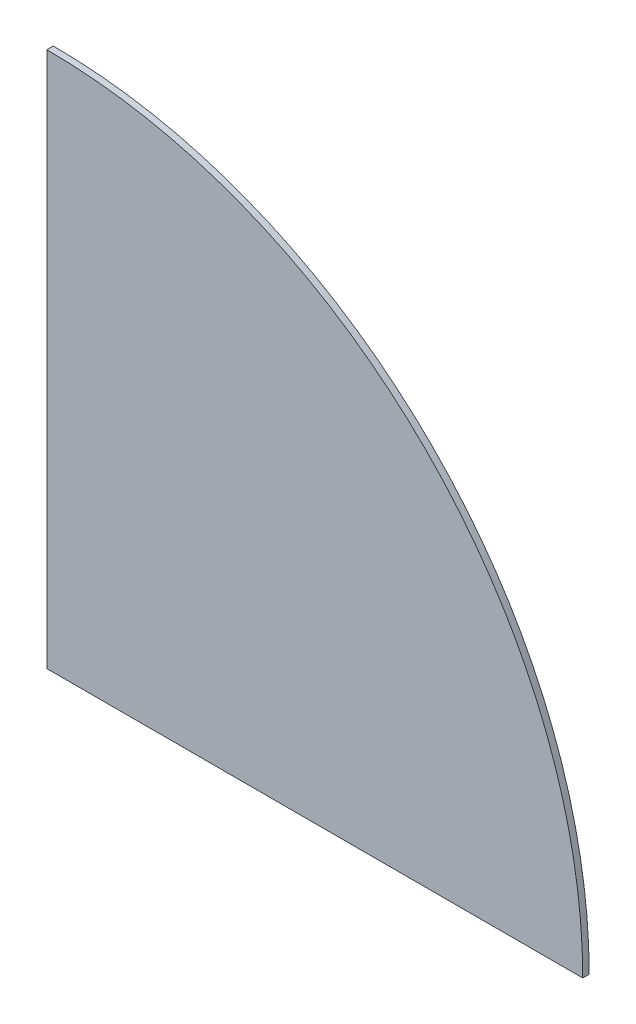
ISO-10303-21;
HEADER;
FILE_DESCRIPTION(('STEP AP214'),'2;1');
FILE_NAME('part.step','',(''),(''),'','','');
FILE_SCHEMA(('AUTOMOTIVE_DESIGN { 1 0 10303 214 1 1 1 1 }'));
ENDSEC;
DATA;
#1=APPLICATION_CONTEXT('core data for automotive mechanical design processes');
#2=APPLICATION_PROTOCOL_DEFINITION('international standard','automotive_design',2000,#1);
#3=PRODUCT_CONTEXT('',#1,'mechanical');
#4=PRODUCT('Part','Part','',(#3));
#5=PRODUCT_RELATED_PRODUCT_CATEGORY('part','',(#4));
#6=PRODUCT_DEFINITION_FORMATION('','',#4);
#7=PRODUCT_DEFINITION_CONTEXT('part definition',#1,'design');
#8=PRODUCT_DEFINITION('design','',#6,#7);
#9=PRODUCT_DEFINITION_SHAPE('','',#8);
#10=(LENGTH_UNIT() NAMED_UNIT(*) SI_UNIT(.MILLI.,.METRE.));
#11=(NAMED_UNIT(*) PLANE_ANGLE_UNIT() SI_UNIT($,.RADIAN.));
#12=(NAMED_UNIT(*) SI_UNIT($,.STERADIAN.) SOLID_ANGLE_UNIT());
#13=UNCERTAINTY_MEASURE_WITH_UNIT(LENGTH_MEASURE(1.E-05),#10,'distance_accuracy_value','');
#14=(GEOMETRIC_REPRESENTATION_CONTEXT(3) GLOBAL_UNCERTAINTY_ASSIGNED_CONTEXT((#13)) GLOBAL_UNIT_ASSIGNED_CONTEXT((#10,
#11,#12)) REPRESENTATION_CONTEXT('',''));
#15=CARTESIAN_POINT('',(0.,0.,0.));
#16=DIRECTION('',(0.,0.,1.));
#17=DIRECTION('',(1.,0.,0.));
#18=AXIS2_PLACEMENT_3D('',#15,#16,#17);
#19=CARTESIAN_POINT('',(0.,0.,1.6));
#20=DIRECTION('',(0.,1.,0.));
#21=DIRECTION('',(0.,0.,1.));
#22=AXIS2_PLACEMENT_3D('',#19,#20,#21);
#23=PLANE('',#22);
#24=DIRECTION('',(1.,0.,0.));
#25=VECTOR('',#24,1.);
#26=CARTESIAN_POINT('',(0.,0.,0.));
#27=LINE('',#26,#25);
#28=CARTESIAN_POINT('',(0.,0.,0.));
#29=VERTEX_POINT('',#28);
#30=CARTESIAN_POINT('',(133.,0.,0.));
#31=VERTEX_POINT('',#30);
#32=EDGE_CURVE('E83',#29,#31,#27,.T.);
#33=ORIENTED_EDGE('',*,*,#32,.T.);
#34=DIRECTION('',(0.,0.,-1.));
#35=VECTOR('',#34,1.);
#36=CARTESIAN_POINT('',(133.,0.,1.6));
#37=LINE('',#36,#35);
#38=CARTESIAN_POINT('',(133.,0.,1.6));
#39=VERTEX_POINT('',#38);
#40=EDGE_CURVE('E11',#39,#31,#37,.T.);
#41=ORIENTED_EDGE('',*,*,#40,.F.);
#42=DIRECTION('',(1.,0.,0.));
#43=VECTOR('',#42,1.);
#44=CARTESIAN_POINT('',(0.,0.,1.6));
#45=LINE('',#44,#43);
#46=CARTESIAN_POINT('',(0.,0.,1.6));
#47=VERTEX_POINT('',#46);
#48=EDGE_CURVE('E76',#47,#39,#45,.T.);
#49=ORIENTED_EDGE('',*,*,#48,.F.);
#50=DIRECTION('',(0.,0.,-1.));
#51=VECTOR('',#50,1.);
#52=CARTESIAN_POINT('',(0.,0.,1.6));
#53=LINE('',#52,#51);
#54=EDGE_CURVE('E84',#47,#29,#53,.T.);
#55=ORIENTED_EDGE('',*,*,#54,.T.);
#56=EDGE_LOOP('',(#33,#41,#49,#55));
#57=FACE_BOUND('',#56,.T.);
#58=ADVANCED_FACE('F36',(#57),#23,.F.);
#59=CARTESIAN_POINT('',(0.,0.,1.6));
#60=DIRECTION('',(0.,0.,-1.));
#61=DIRECTION('',(-1.,0.,0.));
#62=AXIS2_PLACEMENT_3D('',#59,#60,#61);
#63=CYLINDRICAL_SURFACE('',#62,133.);
#64=CARTESIAN_POINT('',(0.,0.,0.));
#65=DIRECTION('',(0.,0.,1.));
#66=DIRECTION('',(1.,0.,0.));
#67=AXIS2_PLACEMENT_3D('',#64,#65,#66);
#68=CIRCLE('',#67,133.);
#69=CARTESIAN_POINT('',(0.,133.,0.));
#70=VERTEX_POINT('',#69);
#71=EDGE_CURVE('E64',#31,#70,#68,.T.);
#72=ORIENTED_EDGE('',*,*,#71,.T.);
#73=DIRECTION('',(0.,0.,-1.));
#74=VECTOR('',#73,1.);
#75=CARTESIAN_POINT('',(0.,133.,1.6));
#76=LINE('',#75,#74);
#77=CARTESIAN_POINT('',(0.,133.,1.6));
#78=VERTEX_POINT('',#77);
#79=EDGE_CURVE('E44',#78,#70,#76,.T.);
#80=ORIENTED_EDGE('',*,*,#79,.F.);
#81=CARTESIAN_POINT('',(0.,0.,1.6));
#82=DIRECTION('',(0.,0.,1.));
#83=DIRECTION('',(1.,0.,0.));
#84=AXIS2_PLACEMENT_3D('',#81,#82,#83);
#85=CIRCLE('',#84,133.);
#86=EDGE_CURVE('E72',#39,#78,#85,.T.);
#87=ORIENTED_EDGE('',*,*,#86,.F.);
#88=ORIENTED_EDGE('',*,*,#40,.T.);
#89=EDGE_LOOP('',(#72,#80,#87,#88));
#90=FACE_BOUND('',#89,.T.);
#91=ADVANCED_FACE('F73',(#90),#63,.T.);
#92=CARTESIAN_POINT('',(0.,0.,1.6));
#93=DIRECTION('',(1.,0.,0.));
#94=DIRECTION('',(0.,0.,-1.));
#95=AXIS2_PLACEMENT_3D('',#92,#93,#94);
#96=PLANE('',#95);
#97=DIRECTION('',(0.,-1.,0.));
#98=VECTOR('',#97,1.);
#99=CARTESIAN_POINT('',(0.,0.,0.));
#100=LINE('',#99,#98);
#101=EDGE_CURVE('E69',#70,#29,#100,.T.);
#102=ORIENTED_EDGE('',*,*,#101,.T.);
#103=ORIENTED_EDGE('',*,*,#54,.F.);
#104=DIRECTION('',(0.,-1.,0.));
#105=VECTOR('',#104,1.);
#106=CARTESIAN_POINT('',(0.,0.,1.6));
#107=LINE('',#106,#105);
#108=EDGE_CURVE('E52',#78,#47,#107,.T.);
#109=ORIENTED_EDGE('',*,*,#108,.F.);
#110=ORIENTED_EDGE('',*,*,#79,.T.);
#111=EDGE_LOOP('',(#102,#103,#109,#110));
#112=FACE_BOUND('',#111,.T.);
#113=ADVANCED_FACE('F91',(#112),#96,.F.);
#114=CARTESIAN_POINT('',(0.,0.,1.6));
#115=DIRECTION('',(0.,0.,1.));
#116=DIRECTION('',(1.,0.,0.));
#117=AXIS2_PLACEMENT_3D('',#114,#115,#116);
#118=PLANE('',#117);
#119=ORIENTED_EDGE('',*,*,#48,.T.);
#120=ORIENTED_EDGE('',*,*,#86,.T.);
#121=ORIENTED_EDGE('',*,*,#108,.T.);
#122=EDGE_LOOP('',(#119,#120,#121));
#123=FACE_BOUND('',#122,.T.);
#124=ADVANCED_FACE('F79',(#123),#118,.T.);
#125=CARTESIAN_POINT('',(0.,0.,0.));
#126=DIRECTION('',(0.,0.,1.));
#127=DIRECTION('',(1.,0.,0.));
#128=AXIS2_PLACEMENT_3D('',#125,#126,#127);
#129=PLANE('',#128);
#130=ORIENTED_EDGE('',*,*,#32,.F.);
#131=ORIENTED_EDGE('',*,*,#101,.F.);
#132=ORIENTED_EDGE('',*,*,#71,.F.);
#133=EDGE_LOOP('',(#130,#131,#132));
#134=FACE_BOUND('',#133,.T.);
#135=ADVANCED_FACE('F92',(#134),#129,.F.);
#136=CLOSED_SHELL('',(#58,#91,#113,#124,#135));
#137=MANIFOLD_SOLID_BREP('B2',#136);
#138=ADVANCED_BREP_SHAPE_REPRESENTATION('',(#18,#137),#14);
#139=SHAPE_DEFINITION_REPRESENTATION(#9,#138);
ENDSEC;
END-ISO-10303-21;
